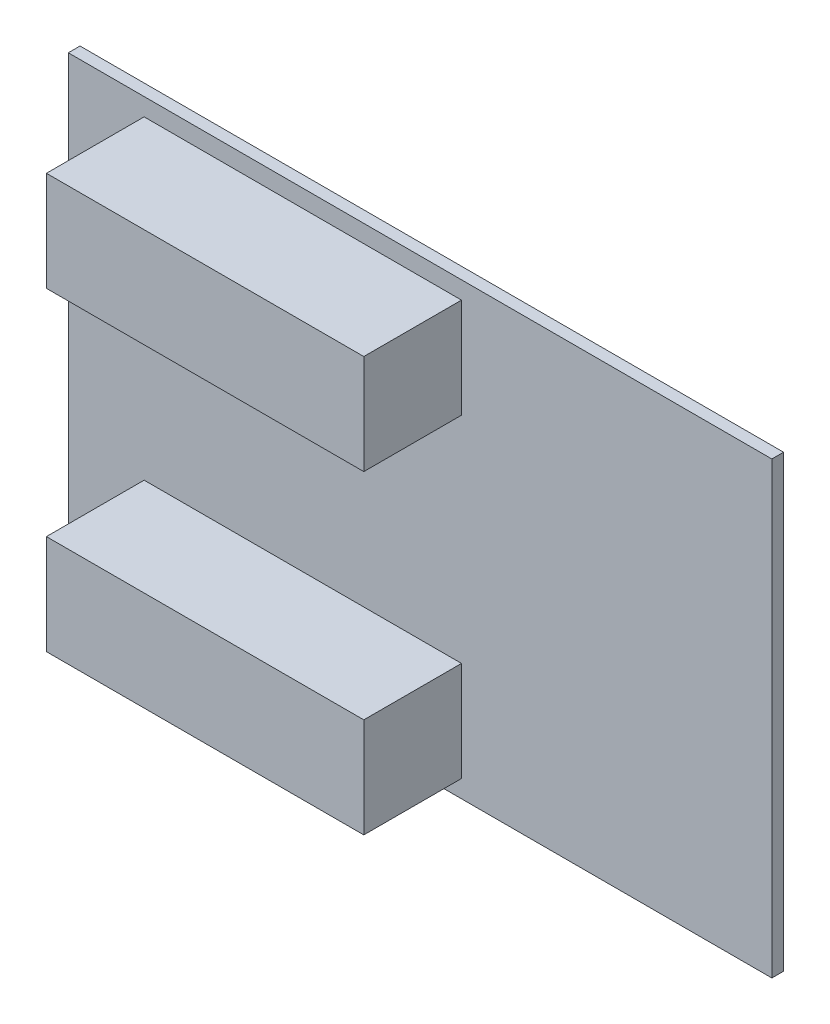
ISO-10303-21;
HEADER;
FILE_DESCRIPTION(('STEP AP214'),'2;1');
FILE_NAME('part.step','',(''),(''),'','','');
FILE_SCHEMA(('AUTOMOTIVE_DESIGN { 1 0 10303 214 1 1 1 1 }'));
ENDSEC;
DATA;
#1=APPLICATION_CONTEXT('core data for automotive mechanical design processes');
#2=APPLICATION_PROTOCOL_DEFINITION('international standard','automotive_design',2000,#1);
#3=PRODUCT_CONTEXT('',#1,'mechanical');
#4=PRODUCT('Part','Part','',(#3));
#5=PRODUCT_RELATED_PRODUCT_CATEGORY('part','',(#4));
#6=PRODUCT_DEFINITION_FORMATION('','',#4);
#7=PRODUCT_DEFINITION_CONTEXT('part definition',#1,'design');
#8=PRODUCT_DEFINITION('design','',#6,#7);
#9=PRODUCT_DEFINITION_SHAPE('','',#8);
#10=(LENGTH_UNIT() NAMED_UNIT(*) SI_UNIT(.MILLI.,.METRE.));
#11=(NAMED_UNIT(*) PLANE_ANGLE_UNIT() SI_UNIT($,.RADIAN.));
#12=(NAMED_UNIT(*) SI_UNIT($,.STERADIAN.) SOLID_ANGLE_UNIT());
#13=UNCERTAINTY_MEASURE_WITH_UNIT(LENGTH_MEASURE(1.E-05),#10,'distance_accuracy_value','');
#14=(GEOMETRIC_REPRESENTATION_CONTEXT(3) GLOBAL_UNCERTAINTY_ASSIGNED_CONTEXT((#13)) GLOBAL_UNIT_ASSIGNED_CONTEXT((#10,
#11,#12)) REPRESENTATION_CONTEXT('',''));
#15=CARTESIAN_POINT('',(0.,0.,0.));
#16=DIRECTION('',(0.,0.,1.));
#17=DIRECTION('',(1.,0.,0.));
#18=AXIS2_PLACEMENT_3D('',#15,#16,#17);
#19=CARTESIAN_POINT('',(0.,0.,3.));
#20=DIRECTION('',(0.,0.,1.));
#21=DIRECTION('',(1.,0.,0.));
#22=AXIS2_PLACEMENT_3D('',#19,#20,#21);
#23=PLANE('',#22);
#24=DIRECTION('',(-1.,0.,0.));
#25=VECTOR('',#24,1.);
#26=CARTESIAN_POINT('',(0.,44.2499999999999,3.));
#27=LINE('',#26,#25);
#28=CARTESIAN_POINT('',(-70.6,44.25,3.));
#29=VERTEX_POINT('',#28);
#30=CARTESIAN_POINT('',(-72.1,44.25,3.));
#31=VERTEX_POINT('',#30);
#32=EDGE_CURVE('E363',#29,#31,#27,.T.);
#33=ORIENTED_EDGE('',*,*,#32,.F.);
#34=DIRECTION('',(0.,-1.,0.));
#35=VECTOR('',#34,1.);
#36=CARTESIAN_POINT('',(-70.6,53.,3.));
#37=LINE('',#36,#35);
#38=CARTESIAN_POINT('',(-70.6,53.,3.));
#39=VERTEX_POINT('',#38);
#40=EDGE_CURVE('E400',#39,#29,#37,.T.);
#41=ORIENTED_EDGE('',*,*,#40,.F.);
#42=DIRECTION('',(-1.,0.,0.));
#43=VECTOR('',#42,1.);
#44=CARTESIAN_POINT('',(-70.6,53.,3.));
#45=LINE('',#44,#43);
#46=CARTESIAN_POINT('',(10.6,53.,3.));
#47=VERTEX_POINT('',#46);
#48=EDGE_CURVE('E393',#47,#39,#45,.T.);
#49=ORIENTED_EDGE('',*,*,#48,.F.);
#50=DIRECTION('',(0.,1.,0.));
#51=VECTOR('',#50,1.);
#52=CARTESIAN_POINT('',(10.6,53.,3.));
#53=LINE('',#52,#51);
#54=CARTESIAN_POINT('',(10.6,27.5,3.));
#55=VERTEX_POINT('',#54);
#56=EDGE_CURVE('E407',#55,#47,#53,.T.);
#57=ORIENTED_EDGE('',*,*,#56,.F.);
#58=DIRECTION('',(1.,0.,0.));
#59=VECTOR('',#58,1.);
#60=CARTESIAN_POINT('',(-70.6,27.5,3.));
#61=LINE('',#60,#59);
#62=CARTESIAN_POINT('',(-70.6,27.5,3.));
#63=VERTEX_POINT('',#62);
#64=EDGE_CURVE('E403',#63,#55,#61,.T.);
#65=ORIENTED_EDGE('',*,*,#64,.F.);
#66=CARTESIAN_POINT('',(-70.6,36.25,3.));
#67=VERTEX_POINT('',#66);
#68=EDGE_CURVE('E388',#67,#63,#37,.T.);
#69=ORIENTED_EDGE('',*,*,#68,.F.);
#70=DIRECTION('',(1.,0.,0.));
#71=VECTOR('',#70,1.);
#72=CARTESIAN_POINT('',(0.,36.25,3.));
#73=LINE('',#72,#71);
#74=CARTESIAN_POINT('',(-72.1,36.25,3.));
#75=VERTEX_POINT('',#74);
#76=EDGE_CURVE('E358',#75,#67,#73,.T.);
#77=ORIENTED_EDGE('',*,*,#76,.F.);
#78=DIRECTION('',(0.,-1.,0.));
#79=VECTOR('',#78,1.);
#80=CARTESIAN_POINT('',(-72.1,0.,3.));
#81=LINE('',#80,#79);
#82=EDGE_CURVE('E336',#31,#75,#81,.T.);
#83=ORIENTED_EDGE('',*,*,#82,.F.);
#84=EDGE_LOOP('',(#33,#41,#49,#57,#65,#69,#77,#83));
#85=FACE_BOUND('',#84,.T.);
#86=DIRECTION('',(0.,1.,0.));
#87=VECTOR('',#86,1.);
#88=CARTESIAN_POINT('',(90.,57.5,3.));
#89=LINE('',#88,#87);
#90=CARTESIAN_POINT('',(90.,-57.5,3.));
#91=VERTEX_POINT('',#90);
#92=CARTESIAN_POINT('',(90.,57.5,3.));
#93=VERTEX_POINT('',#92);
#94=EDGE_CURVE('E441',#91,#93,#89,.T.);
#95=ORIENTED_EDGE('',*,*,#94,.T.);
#96=DIRECTION('',(-1.,0.,0.));
#97=VECTOR('',#96,1.);
#98=CARTESIAN_POINT('',(-90.,57.5,3.));
#99=LINE('',#98,#97);
#100=CARTESIAN_POINT('',(-90.,57.5,3.));
#101=VERTEX_POINT('',#100);
#102=EDGE_CURVE('E444',#93,#101,#99,.T.);
#103=ORIENTED_EDGE('',*,*,#102,.T.);
#104=DIRECTION('',(0.,-1.,0.));
#105=VECTOR('',#104,1.);
#106=CARTESIAN_POINT('',(-90.,57.5,3.));
#107=LINE('',#106,#105);
#108=CARTESIAN_POINT('',(-90.,-57.5,3.));
#109=VERTEX_POINT('',#108);
#110=EDGE_CURVE('E447',#101,#109,#107,.T.);
#111=ORIENTED_EDGE('',*,*,#110,.T.);
#112=DIRECTION('',(1.,0.,0.));
#113=VECTOR('',#112,1.);
#114=CARTESIAN_POINT('',(-90.,-57.5,3.));
#115=LINE('',#114,#113);
#116=EDGE_CURVE('E449',#109,#91,#115,.T.);
#117=ORIENTED_EDGE('',*,*,#116,.T.);
#118=EDGE_LOOP('',(#95,#103,#111,#117));
#119=FACE_BOUND('',#118,.T.);
#120=DIRECTION('',(0.,1.,0.));
#121=VECTOR('',#120,1.);
#122=CARTESIAN_POINT('',(-70.6,-53.,3.));
#123=LINE('',#122,#121);
#124=CARTESIAN_POINT('',(-70.6,-53.,3.));
#125=VERTEX_POINT('',#124);
#126=CARTESIAN_POINT('',(-70.6,-44.25,3.));
#127=VERTEX_POINT('',#126);
#128=EDGE_CURVE('E301',#125,#127,#123,.T.);
#129=ORIENTED_EDGE('',*,*,#128,.T.);
#130=DIRECTION('',(-1.,0.,0.));
#131=VECTOR('',#130,1.);
#132=CARTESIAN_POINT('',(0.,-44.2499999999999,3.));
#133=LINE('',#132,#131);
#134=CARTESIAN_POINT('',(-72.1,-44.25,3.));
#135=VERTEX_POINT('',#134);
#136=EDGE_CURVE('E266',#127,#135,#133,.T.);
#137=ORIENTED_EDGE('',*,*,#136,.T.);
#138=DIRECTION('',(0.,1.,0.));
#139=VECTOR('',#138,1.);
#140=CARTESIAN_POINT('',(-72.1,0.,3.));
#141=LINE('',#140,#139);
#142=CARTESIAN_POINT('',(-72.1,-36.25,3.));
#143=VERTEX_POINT('',#142);
#144=EDGE_CURVE('E268',#135,#143,#141,.T.);
#145=ORIENTED_EDGE('',*,*,#144,.T.);
#146=DIRECTION('',(1.,0.,0.));
#147=VECTOR('',#146,1.);
#148=CARTESIAN_POINT('',(0.,-36.25,3.));
#149=LINE('',#148,#147);
#150=CARTESIAN_POINT('',(-70.6,-36.25,3.));
#151=VERTEX_POINT('',#150);
#152=EDGE_CURVE('E255',#143,#151,#149,.T.);
#153=ORIENTED_EDGE('',*,*,#152,.T.);
#154=CARTESIAN_POINT('',(-70.6,-27.5,3.));
#155=VERTEX_POINT('',#154);
#156=EDGE_CURVE('E286',#151,#155,#123,.T.);
#157=ORIENTED_EDGE('',*,*,#156,.T.);
#158=DIRECTION('',(1.,0.,0.));
#159=VECTOR('',#158,1.);
#160=CARTESIAN_POINT('',(-70.6,-27.5,3.));
#161=LINE('',#160,#159);
#162=CARTESIAN_POINT('',(10.6,-27.5,3.));
#163=VERTEX_POINT('',#162);
#164=EDGE_CURVE('E291',#155,#163,#161,.T.);
#165=ORIENTED_EDGE('',*,*,#164,.T.);
#166=DIRECTION('',(0.,-1.,0.));
#167=VECTOR('',#166,1.);
#168=CARTESIAN_POINT('',(10.6,-53.,3.));
#169=LINE('',#168,#167);
#170=CARTESIAN_POINT('',(10.6,-53.,3.));
#171=VERTEX_POINT('',#170);
#172=EDGE_CURVE('E308',#163,#171,#169,.T.);
#173=ORIENTED_EDGE('',*,*,#172,.T.);
#174=DIRECTION('',(-1.,0.,0.));
#175=VECTOR('',#174,1.);
#176=CARTESIAN_POINT('',(-70.6,-53.,3.));
#177=LINE('',#176,#175);
#178=EDGE_CURVE('E304',#171,#125,#177,.T.);
#179=ORIENTED_EDGE('',*,*,#178,.T.);
#180=EDGE_LOOP('',(#129,#137,#145,#153,#157,#165,#173,#179));
#181=FACE_BOUND('',#180,.T.);
#182=ADVANCED_FACE('F37',(#85,#119,#181),#23,.T.);
#183=CARTESIAN_POINT('',(8.1,-50.5,28.001));
#184=DIRECTION('',(-1.,0.,0.));
#185=DIRECTION('',(0.,-1.,0.));
#186=AXIS2_PLACEMENT_3D('',#183,#184,#185);
#187=PLANE('',#186);
#188=DIRECTION('',(0.,0.,-1.));
#189=VECTOR('',#188,1.);
#190=CARTESIAN_POINT('',(8.1,-50.5,28.001));
#191=LINE('',#190,#189);
#192=CARTESIAN_POINT('',(8.1,-50.5,25.5));
#193=VERTEX_POINT('',#192);
#194=CARTESIAN_POINT('',(8.1,-50.5,0.));
#195=VERTEX_POINT('',#194);
#196=EDGE_CURVE('E333',#193,#195,#191,.T.);
#197=ORIENTED_EDGE('',*,*,#196,.F.);
#198=DIRECTION('',(0.,1.,0.));
#199=VECTOR('',#198,1.);
#200=CARTESIAN_POINT('',(8.1,-50.5,25.5));
#201=LINE('',#200,#199);
#202=CARTESIAN_POINT('',(8.09999999999999,-30.,25.5));
#203=VERTEX_POINT('',#202);
#204=EDGE_CURVE('E283',#193,#203,#201,.T.);
#205=ORIENTED_EDGE('',*,*,#204,.T.);
#206=DIRECTION('',(0.,0.,-1.));
#207=VECTOR('',#206,1.);
#208=CARTESIAN_POINT('',(8.09999999999999,-30.,28.001));
#209=LINE('',#208,#207);
#210=CARTESIAN_POINT('',(8.09999999999999,-30.,0.));
#211=VERTEX_POINT('',#210);
#212=EDGE_CURVE('E334',#203,#211,#209,.T.);
#213=ORIENTED_EDGE('',*,*,#212,.T.);
#214=DIRECTION('',(0.,1.,0.));
#215=VECTOR('',#214,1.);
#216=CARTESIAN_POINT('',(8.1,-50.5,0.));
#217=LINE('',#216,#215);
#218=EDGE_CURVE('E321',#195,#211,#217,.T.);
#219=ORIENTED_EDGE('',*,*,#218,.F.);
#220=EDGE_LOOP('',(#197,#205,#213,#219));
#221=FACE_BOUND('',#220,.T.);
#222=ADVANCED_FACE('F494',(#221),#187,.T.);
#223=CARTESIAN_POINT('',(8.09999999999999,-30.,28.001));
#224=DIRECTION('',(0.,-1.,0.));
#225=DIRECTION('',(0.,0.,-1.));
#226=AXIS2_PLACEMENT_3D('',#223,#224,#225);
#227=PLANE('',#226);
#228=ORIENTED_EDGE('',*,*,#212,.F.);
#229=DIRECTION('',(-1.,0.,0.));
#230=VECTOR('',#229,1.);
#231=CARTESIAN_POINT('',(8.09999999999999,-30.,25.5));
#232=LINE('',#231,#230);
#233=CARTESIAN_POINT('',(-68.1,-30.,25.5));
#234=VERTEX_POINT('',#233);
#235=EDGE_CURVE('E280',#203,#234,#232,.T.);
#236=ORIENTED_EDGE('',*,*,#235,.T.);
#237=DIRECTION('',(0.,0.,-1.));
#238=VECTOR('',#237,1.);
#239=CARTESIAN_POINT('',(-68.1,-30.,28.001));
#240=LINE('',#239,#238);
#241=CARTESIAN_POINT('',(-68.1,-30.,0.));
#242=VERTEX_POINT('',#241);
#243=EDGE_CURVE('E337',#234,#242,#240,.T.);
#244=ORIENTED_EDGE('',*,*,#243,.T.);
#245=DIRECTION('',(-1.,0.,0.));
#246=VECTOR('',#245,1.);
#247=CARTESIAN_POINT('',(8.09999999999999,-30.,0.));
#248=LINE('',#247,#246);
#249=EDGE_CURVE('E330',#211,#242,#248,.T.);
#250=ORIENTED_EDGE('',*,*,#249,.F.);
#251=EDGE_LOOP('',(#228,#236,#244,#250));
#252=FACE_BOUND('',#251,.T.);
#253=ADVANCED_FACE('F500',(#252),#227,.T.);
#254=CARTESIAN_POINT('',(-68.1,-50.5,28.001));
#255=DIRECTION('',(1.,0.,0.));
#256=DIRECTION('',(0.,1.,0.));
#257=AXIS2_PLACEMENT_3D('',#254,#255,#256);
#258=PLANE('',#257);
#259=DIRECTION('',(0.,-1.,0.));
#260=VECTOR('',#259,1.);
#261=CARTESIAN_POINT('',(-68.1,0.,1.4));
#262=LINE('',#261,#260);
#263=CARTESIAN_POINT('',(-68.1,-36.25,1.4));
#264=VERTEX_POINT('',#263);
#265=CARTESIAN_POINT('',(-68.1,-44.25,1.4));
#266=VERTEX_POINT('',#265);
#267=EDGE_CURVE('E240',#264,#266,#262,.T.);
#268=ORIENTED_EDGE('',*,*,#267,.T.);
#269=DIRECTION('',(0.,0.,1.));
#270=VECTOR('',#269,1.);
#271=CARTESIAN_POINT('',(-68.1,-44.25,1.4));
#272=LINE('',#271,#270);
#273=CARTESIAN_POINT('',(-68.1,-44.25,3.));
#274=VERTEX_POINT('',#273);
#275=EDGE_CURVE('E246',#266,#274,#272,.T.);
#276=ORIENTED_EDGE('',*,*,#275,.T.);
#277=DIRECTION('',(0.,-1.,0.));
#278=VECTOR('',#277,1.);
#279=CARTESIAN_POINT('',(-68.1,0.,3.));
#280=LINE('',#279,#278);
#281=CARTESIAN_POINT('',(-68.1,-36.25,3.));
#282=VERTEX_POINT('',#281);
#283=EDGE_CURVE('E264',#282,#274,#280,.T.);
#284=ORIENTED_EDGE('',*,*,#283,.F.);
#285=DIRECTION('',(0.,0.,1.));
#286=VECTOR('',#285,1.);
#287=CARTESIAN_POINT('',(-68.1,-36.25,1.4));
#288=LINE('',#287,#286);
#289=EDGE_CURVE('E52',#264,#282,#288,.T.);
#290=ORIENTED_EDGE('',*,*,#289,.F.);
#291=EDGE_LOOP('',(#268,#276,#284,#290));
#292=FACE_BOUND('',#291,.T.);
#293=ORIENTED_EDGE('',*,*,#243,.F.);
#294=DIRECTION('',(0.,-1.,0.));
#295=VECTOR('',#294,1.);
#296=CARTESIAN_POINT('',(-68.1,-50.5,25.5));
#297=LINE('',#296,#295);
#298=CARTESIAN_POINT('',(-68.1,-50.5,25.5));
#299=VERTEX_POINT('',#298);
#300=EDGE_CURVE('E277',#234,#299,#297,.T.);
#301=ORIENTED_EDGE('',*,*,#300,.T.);
#302=DIRECTION('',(0.,0.,-1.));
#303=VECTOR('',#302,1.);
#304=CARTESIAN_POINT('',(-68.1,-50.5,28.001));
#305=LINE('',#304,#303);
#306=CARTESIAN_POINT('',(-68.1,-50.5,0.));
#307=VERTEX_POINT('',#306);
#308=EDGE_CURVE('E339',#299,#307,#305,.T.);
#309=ORIENTED_EDGE('',*,*,#308,.T.);
#310=DIRECTION('',(0.,-1.,0.));
#311=VECTOR('',#310,1.);
#312=CARTESIAN_POINT('',(-68.1,-50.5,0.));
#313=LINE('',#312,#311);
#314=EDGE_CURVE('E327',#242,#307,#313,.T.);
#315=ORIENTED_EDGE('',*,*,#314,.F.);
#316=EDGE_LOOP('',(#293,#301,#309,#315));
#317=FACE_BOUND('',#316,.T.);
#318=ADVANCED_FACE('F253',(#292,#317),#258,.T.);
#319=CARTESIAN_POINT('',(8.1,-50.5,28.001));
#320=DIRECTION('',(0.,1.,0.));
#321=DIRECTION('',(0.,0.,1.));
#322=AXIS2_PLACEMENT_3D('',#319,#320,#321);
#323=PLANE('',#322);
#324=ORIENTED_EDGE('',*,*,#308,.F.);
#325=DIRECTION('',(1.,0.,0.));
#326=VECTOR('',#325,1.);
#327=CARTESIAN_POINT('',(8.1,-50.5,25.5));
#328=LINE('',#327,#326);
#329=EDGE_CURVE('E250',#299,#193,#328,.T.);
#330=ORIENTED_EDGE('',*,*,#329,.T.);
#331=ORIENTED_EDGE('',*,*,#196,.T.);
#332=DIRECTION('',(1.,0.,0.));
#333=VECTOR('',#332,1.);
#334=CARTESIAN_POINT('',(8.1,-50.5,0.));
#335=LINE('',#334,#333);
#336=EDGE_CURVE('E324',#307,#195,#335,.T.);
#337=ORIENTED_EDGE('',*,*,#336,.F.);
#338=EDGE_LOOP('',(#324,#330,#331,#337));
#339=FACE_BOUND('',#338,.T.);
#340=ADVANCED_FACE('F511',(#339),#323,.T.);
#341=CARTESIAN_POINT('',(0.,0.,0.));
#342=DIRECTION('',(0.,0.,1.));
#343=DIRECTION('',(1.,0.,0.));
#344=AXIS2_PLACEMENT_3D('',#341,#342,#343);
#345=PLANE('',#344);
#346=DIRECTION('',(0.,1.,0.));
#347=VECTOR('',#346,1.);
#348=CARTESIAN_POINT('',(90.,57.5,0.));
#349=LINE('',#348,#347);
#350=CARTESIAN_POINT('',(90.,-57.5,0.));
#351=VERTEX_POINT('',#350);
#352=CARTESIAN_POINT('',(90.,57.5,0.));
#353=VERTEX_POINT('',#352);
#354=EDGE_CURVE('E435',#351,#353,#349,.T.);
#355=ORIENTED_EDGE('',*,*,#354,.F.);
#356=DIRECTION('',(1.,0.,0.));
#357=VECTOR('',#356,1.);
#358=CARTESIAN_POINT('',(-90.,-57.5,0.));
#359=LINE('',#358,#357);
#360=CARTESIAN_POINT('',(-90.,-57.5,0.));
#361=VERTEX_POINT('',#360);
#362=EDGE_CURVE('E445',#361,#351,#359,.T.);
#363=ORIENTED_EDGE('',*,*,#362,.F.);
#364=DIRECTION('',(0.,-1.,0.));
#365=VECTOR('',#364,1.);
#366=CARTESIAN_POINT('',(-90.,57.5,0.));
#367=LINE('',#366,#365);
#368=CARTESIAN_POINT('',(-90.,57.5,0.));
#369=VERTEX_POINT('',#368);
#370=EDGE_CURVE('E456',#369,#361,#367,.T.);
#371=ORIENTED_EDGE('',*,*,#370,.F.);
#372=DIRECTION('',(-1.,0.,0.));
#373=VECTOR('',#372,1.);
#374=CARTESIAN_POINT('',(-90.,57.5,0.));
#375=LINE('',#374,#373);
#376=EDGE_CURVE('E454',#353,#369,#375,.T.);
#377=ORIENTED_EDGE('',*,*,#376,.F.);
#378=EDGE_LOOP('',(#355,#363,#371,#377));
#379=FACE_BOUND('',#378,.T.);
#380=DIRECTION('',(-1.,0.,0.));
#381=VECTOR('',#380,1.);
#382=CARTESIAN_POINT('',(8.09999999999999,30.,0.));
#383=LINE('',#382,#381);
#384=CARTESIAN_POINT('',(8.09999999999999,30.,0.));
#385=VERTEX_POINT('',#384);
#386=CARTESIAN_POINT('',(-68.1,30.,0.));
#387=VERTEX_POINT('',#386);
#388=EDGE_CURVE('E423',#385,#387,#383,.T.);
#389=ORIENTED_EDGE('',*,*,#388,.F.);
#390=DIRECTION('',(0.,-1.,0.));
#391=VECTOR('',#390,1.);
#392=CARTESIAN_POINT('',(8.1,50.5,0.));
#393=LINE('',#392,#391);
#394=CARTESIAN_POINT('',(8.1,50.5,0.));
#395=VERTEX_POINT('',#394);
#396=EDGE_CURVE('E420',#395,#385,#393,.T.);
#397=ORIENTED_EDGE('',*,*,#396,.F.);
#398=DIRECTION('',(1.,0.,0.));
#399=VECTOR('',#398,1.);
#400=CARTESIAN_POINT('',(8.1,50.5,0.));
#401=LINE('',#400,#399);
#402=CARTESIAN_POINT('',(-68.1,50.5,0.));
#403=VERTEX_POINT('',#402);
#404=EDGE_CURVE('E429',#403,#395,#401,.T.);
#405=ORIENTED_EDGE('',*,*,#404,.F.);
#406=DIRECTION('',(0.,1.,0.));
#407=VECTOR('',#406,1.);
#408=CARTESIAN_POINT('',(-68.1,50.5,0.));
#409=LINE('',#408,#407);
#410=EDGE_CURVE('E426',#387,#403,#409,.T.);
#411=ORIENTED_EDGE('',*,*,#410,.F.);
#412=EDGE_LOOP('',(#389,#397,#405,#411));
#413=FACE_BOUND('',#412,.T.);
#414=ORIENTED_EDGE('',*,*,#218,.T.);
#415=ORIENTED_EDGE('',*,*,#249,.T.);
#416=ORIENTED_EDGE('',*,*,#314,.T.);
#417=ORIENTED_EDGE('',*,*,#336,.T.);
#418=EDGE_LOOP('',(#414,#415,#416,#417));
#419=FACE_BOUND('',#418,.T.);
#420=ADVANCED_FACE('F474',(#379,#413,#419),#345,.F.);
#421=CARTESIAN_POINT('',(-68.1,50.5,3.001));
#422=DIRECTION('',(-1.,0.,0.));
#423=DIRECTION('',(0.,-1.,0.));
#424=AXIS2_PLACEMENT_3D('',#421,#422,#423);
#425=PLANE('',#424);
#426=DIRECTION('',(0.,1.,0.));
#427=VECTOR('',#426,1.);
#428=CARTESIAN_POINT('',(-68.1,50.5,25.5));
#429=LINE('',#428,#427);
#430=CARTESIAN_POINT('',(-68.1,30.,25.5));
#431=VERTEX_POINT('',#430);
#432=CARTESIAN_POINT('',(-68.1,50.5,25.5));
#433=VERTEX_POINT('',#432);
#434=EDGE_CURVE('E379',#431,#433,#429,.T.);
#435=ORIENTED_EDGE('',*,*,#434,.F.);
#436=DIRECTION('',(0.,0.,-1.));
#437=VECTOR('',#436,1.);
#438=CARTESIAN_POINT('',(-68.1,30.,3.001));
#439=LINE('',#438,#437);
#440=EDGE_CURVE('E438',#431,#387,#439,.T.);
#441=ORIENTED_EDGE('',*,*,#440,.T.);
#442=ORIENTED_EDGE('',*,*,#410,.T.);
#443=DIRECTION('',(0.,0.,-1.));
#444=VECTOR('',#443,1.);
#445=CARTESIAN_POINT('',(-68.1,50.5,3.001));
#446=LINE('',#445,#444);
#447=EDGE_CURVE('E436',#433,#403,#446,.T.);
#448=ORIENTED_EDGE('',*,*,#447,.F.);
#449=EDGE_LOOP('',(#435,#441,#442,#448));
#450=FACE_BOUND('',#449,.T.);
#451=DIRECTION('',(0.,1.,0.));
#452=VECTOR('',#451,1.);
#453=CARTESIAN_POINT('',(-68.1,0.,1.4));
#454=LINE('',#453,#452);
#455=CARTESIAN_POINT('',(-68.1,36.25,1.4));
#456=VERTEX_POINT('',#455);
#457=CARTESIAN_POINT('',(-68.1,44.25,1.4));
#458=VERTEX_POINT('',#457);
#459=EDGE_CURVE('E349',#456,#458,#454,.T.);
#460=ORIENTED_EDGE('',*,*,#459,.F.);
#461=DIRECTION('',(0.,0.,1.));
#462=VECTOR('',#461,1.);
#463=CARTESIAN_POINT('',(-68.1,36.25,1.4));
#464=LINE('',#463,#462);
#465=CARTESIAN_POINT('',(-68.1,36.25,3.));
#466=VERTEX_POINT('',#465);
#467=EDGE_CURVE('E373',#456,#466,#464,.T.);
#468=ORIENTED_EDGE('',*,*,#467,.T.);
#469=DIRECTION('',(0.,1.,0.));
#470=VECTOR('',#469,1.);
#471=CARTESIAN_POINT('',(-68.1,0.,3.));
#472=LINE('',#471,#470);
#473=CARTESIAN_POINT('',(-68.1,44.25,3.));
#474=VERTEX_POINT('',#473);
#475=EDGE_CURVE('E360',#466,#474,#472,.T.);
#476=ORIENTED_EDGE('',*,*,#475,.T.);
#477=DIRECTION('',(0.,0.,1.));
#478=VECTOR('',#477,1.);
#479=CARTESIAN_POINT('',(-68.1,44.25,1.4));
#480=LINE('',#479,#478);
#481=EDGE_CURVE('E370',#458,#474,#480,.T.);
#482=ORIENTED_EDGE('',*,*,#481,.F.);
#483=EDGE_LOOP('',(#460,#468,#476,#482));
#484=FACE_BOUND('',#483,.T.);
#485=ADVANCED_FACE('F510',(#450,#484),#425,.F.);
#486=CARTESIAN_POINT('',(8.1,50.5,3.001));
#487=DIRECTION('',(1.,0.,0.));
#488=DIRECTION('',(0.,1.,0.));
#489=AXIS2_PLACEMENT_3D('',#486,#487,#488);
#490=PLANE('',#489);
#491=DIRECTION('',(0.,-1.,0.));
#492=VECTOR('',#491,1.);
#493=CARTESIAN_POINT('',(8.1,50.5,25.5));
#494=LINE('',#493,#492);
#495=CARTESIAN_POINT('',(8.1,50.5,25.5));
#496=VERTEX_POINT('',#495);
#497=CARTESIAN_POINT('',(8.09999999999999,30.,25.5));
#498=VERTEX_POINT('',#497);
#499=EDGE_CURVE('E385',#496,#498,#494,.T.);
#500=ORIENTED_EDGE('',*,*,#499,.F.);
#501=DIRECTION('',(0.,0.,-1.));
#502=VECTOR('',#501,1.);
#503=CARTESIAN_POINT('',(8.1,50.5,3.001));
#504=LINE('',#503,#502);
#505=EDGE_CURVE('E433',#496,#395,#504,.T.);
#506=ORIENTED_EDGE('',*,*,#505,.T.);
#507=ORIENTED_EDGE('',*,*,#396,.T.);
#508=DIRECTION('',(0.,0.,-1.));
#509=VECTOR('',#508,1.);
#510=CARTESIAN_POINT('',(8.09999999999999,30.,3.001));
#511=LINE('',#510,#509);
#512=EDGE_CURVE('E432',#498,#385,#511,.T.);
#513=ORIENTED_EDGE('',*,*,#512,.F.);
#514=EDGE_LOOP('',(#500,#506,#507,#513));
#515=FACE_BOUND('',#514,.T.);
#516=ADVANCED_FACE('F506',(#515),#490,.F.);
#517=CARTESIAN_POINT('',(8.1,50.5,3.001));
#518=DIRECTION('',(0.,1.,0.));
#519=DIRECTION('',(0.,0.,1.));
#520=AXIS2_PLACEMENT_3D('',#517,#518,#519);
#521=PLANE('',#520);
#522=DIRECTION('',(1.,0.,0.));
#523=VECTOR('',#522,1.);
#524=CARTESIAN_POINT('',(8.1,50.5,25.5));
#525=LINE('',#524,#523);
#526=EDGE_CURVE('E382',#433,#496,#525,.T.);
#527=ORIENTED_EDGE('',*,*,#526,.F.);
#528=ORIENTED_EDGE('',*,*,#447,.T.);
#529=ORIENTED_EDGE('',*,*,#404,.T.);
#530=ORIENTED_EDGE('',*,*,#505,.F.);
#531=EDGE_LOOP('',(#527,#528,#529,#530));
#532=FACE_BOUND('',#531,.T.);
#533=ADVANCED_FACE('F541',(#532),#521,.F.);
#534=CARTESIAN_POINT('',(8.09999999999999,30.,3.001));
#535=DIRECTION('',(0.,-1.,0.));
#536=DIRECTION('',(0.,0.,-1.));
#537=AXIS2_PLACEMENT_3D('',#534,#535,#536);
#538=PLANE('',#537);
#539=DIRECTION('',(-1.,0.,0.));
#540=VECTOR('',#539,1.);
#541=CARTESIAN_POINT('',(8.09999999999999,30.,25.5));
#542=LINE('',#541,#540);
#543=EDGE_CURVE('E369',#498,#431,#542,.T.);
#544=ORIENTED_EDGE('',*,*,#543,.F.);
#545=ORIENTED_EDGE('',*,*,#512,.T.);
#546=ORIENTED_EDGE('',*,*,#388,.T.);
#547=ORIENTED_EDGE('',*,*,#440,.F.);
#548=EDGE_LOOP('',(#544,#545,#546,#547));
#549=FACE_BOUND('',#548,.T.);
#550=ADVANCED_FACE('F492',(#549),#538,.F.);
#551=CARTESIAN_POINT('',(90.,57.5,3.));
#552=DIRECTION('',(-1.,0.,0.));
#553=DIRECTION('',(0.,0.,1.));
#554=AXIS2_PLACEMENT_3D('',#551,#552,#553);
#555=PLANE('',#554);
#556=ORIENTED_EDGE('',*,*,#354,.T.);
#557=DIRECTION('',(0.,0.,-1.));
#558=VECTOR('',#557,1.);
#559=CARTESIAN_POINT('',(90.,57.5,3.));
#560=LINE('',#559,#558);
#561=EDGE_CURVE('E11',#93,#353,#560,.T.);
#562=ORIENTED_EDGE('',*,*,#561,.F.);
#563=ORIENTED_EDGE('',*,*,#94,.F.);
#564=DIRECTION('',(0.,0.,-1.));
#565=VECTOR('',#564,1.);
#566=CARTESIAN_POINT('',(90.,-57.5,3.));
#567=LINE('',#566,#565);
#568=EDGE_CURVE('E451',#91,#351,#567,.T.);
#569=ORIENTED_EDGE('',*,*,#568,.T.);
#570=EDGE_LOOP('',(#556,#562,#563,#569));
#571=FACE_BOUND('',#570,.T.);
#572=ADVANCED_FACE('F39',(#571),#555,.F.);
#573=CARTESIAN_POINT('',(-90.,57.5,3.));
#574=DIRECTION('',(0.,-1.,0.));
#575=DIRECTION('',(0.,0.,-1.));
#576=AXIS2_PLACEMENT_3D('',#573,#574,#575);
#577=PLANE('',#576);
#578=ORIENTED_EDGE('',*,*,#376,.T.);
#579=DIRECTION('',(0.,0.,-1.));
#580=VECTOR('',#579,1.);
#581=CARTESIAN_POINT('',(-90.,57.5,3.));
#582=LINE('',#581,#580);
#583=EDGE_CURVE('E45',#101,#369,#582,.T.);
#584=ORIENTED_EDGE('',*,*,#583,.F.);
#585=ORIENTED_EDGE('',*,*,#102,.F.);
#586=ORIENTED_EDGE('',*,*,#561,.T.);
#587=EDGE_LOOP('',(#578,#584,#585,#586));
#588=FACE_BOUND('',#587,.T.);
#589=ADVANCED_FACE('F485',(#588),#577,.F.);
#590=CARTESIAN_POINT('',(-90.,57.5,3.));
#591=DIRECTION('',(1.,0.,0.));
#592=DIRECTION('',(0.,0.,-1.));
#593=AXIS2_PLACEMENT_3D('',#590,#591,#592);
#594=PLANE('',#593);
#595=ORIENTED_EDGE('',*,*,#370,.T.);
#596=DIRECTION('',(0.,0.,-1.));
#597=VECTOR('',#596,1.);
#598=CARTESIAN_POINT('',(-90.,-57.5,3.));
#599=LINE('',#598,#597);
#600=EDGE_CURVE('E461',#109,#361,#599,.T.);
#601=ORIENTED_EDGE('',*,*,#600,.F.);
#602=ORIENTED_EDGE('',*,*,#110,.F.);
#603=ORIENTED_EDGE('',*,*,#583,.T.);
#604=EDGE_LOOP('',(#595,#601,#602,#603));
#605=FACE_BOUND('',#604,.T.);
#606=ADVANCED_FACE('F468',(#605),#594,.F.);
#607=CARTESIAN_POINT('',(-90.,-57.5,3.));
#608=DIRECTION('',(0.,1.,0.));
#609=DIRECTION('',(0.,0.,1.));
#610=AXIS2_PLACEMENT_3D('',#607,#608,#609);
#611=PLANE('',#610);
#612=ORIENTED_EDGE('',*,*,#362,.T.);
#613=ORIENTED_EDGE('',*,*,#568,.F.);
#614=ORIENTED_EDGE('',*,*,#116,.F.);
#615=ORIENTED_EDGE('',*,*,#600,.T.);
#616=EDGE_LOOP('',(#612,#613,#614,#615));
#617=FACE_BOUND('',#616,.T.);
#618=ADVANCED_FACE('F478',(#617),#611,.F.);
#619=CARTESIAN_POINT('',(0.,0.,28.));
#620=DIRECTION('',(0.,0.,1.));
#621=DIRECTION('',(1.,0.,0.));
#622=AXIS2_PLACEMENT_3D('',#619,#620,#621);
#623=PLANE('',#622);
#624=DIRECTION('',(0.,-1.,0.));
#625=VECTOR('',#624,1.);
#626=CARTESIAN_POINT('',(-70.6,53.,28.));
#627=LINE('',#626,#625);
#628=CARTESIAN_POINT('',(-70.6,53.,28.));
#629=VERTEX_POINT('',#628);
#630=CARTESIAN_POINT('',(-70.6,27.5,28.));
#631=VERTEX_POINT('',#630);
#632=EDGE_CURVE('E389',#629,#631,#627,.T.);
#633=ORIENTED_EDGE('',*,*,#632,.T.);
#634=DIRECTION('',(1.,0.,0.));
#635=VECTOR('',#634,1.);
#636=CARTESIAN_POINT('',(-70.6,27.5,28.));
#637=LINE('',#636,#635);
#638=CARTESIAN_POINT('',(10.6,27.5,28.));
#639=VERTEX_POINT('',#638);
#640=EDGE_CURVE('E392',#631,#639,#637,.T.);
#641=ORIENTED_EDGE('',*,*,#640,.T.);
#642=DIRECTION('',(0.,1.,0.));
#643=VECTOR('',#642,1.);
#644=CARTESIAN_POINT('',(10.6,53.,28.));
#645=LINE('',#644,#643);
#646=CARTESIAN_POINT('',(10.6,53.,28.));
#647=VERTEX_POINT('',#646);
#648=EDGE_CURVE('E395',#639,#647,#645,.T.);
#649=ORIENTED_EDGE('',*,*,#648,.T.);
#650=DIRECTION('',(-1.,0.,0.));
#651=VECTOR('',#650,1.);
#652=CARTESIAN_POINT('',(-70.6,53.,28.));
#653=LINE('',#652,#651);
#654=EDGE_CURVE('E397',#647,#629,#653,.T.);
#655=ORIENTED_EDGE('',*,*,#654,.T.);
#656=EDGE_LOOP('',(#633,#641,#649,#655));
#657=FACE_BOUND('',#656,.T.);
#658=ADVANCED_FACE('F513',(#657),#623,.T.);
#659=CARTESIAN_POINT('',(-70.6,53.,28.));
#660=DIRECTION('',(1.,0.,0.));
#661=DIRECTION('',(0.,0.,-1.));
#662=AXIS2_PLACEMENT_3D('',#659,#660,#661);
#663=PLANE('',#662);
#664=DIRECTION('',(0.,0.,-1.));
#665=VECTOR('',#664,1.);
#666=CARTESIAN_POINT('',(-70.6,53.,28.));
#667=LINE('',#666,#665);
#668=EDGE_CURVE('E399',#629,#39,#667,.T.);
#669=ORIENTED_EDGE('',*,*,#668,.T.);
#670=ORIENTED_EDGE('',*,*,#40,.T.);
#671=EDGE_CURVE('E404',#29,#67,#37,.T.);
#672=ORIENTED_EDGE('',*,*,#671,.T.);
#673=ORIENTED_EDGE('',*,*,#68,.T.);
#674=DIRECTION('',(0.,0.,-1.));
#675=VECTOR('',#674,1.);
#676=CARTESIAN_POINT('',(-70.6,27.5,28.));
#677=LINE('',#676,#675);
#678=EDGE_CURVE('E417',#631,#63,#677,.T.);
#679=ORIENTED_EDGE('',*,*,#678,.F.);
#680=ORIENTED_EDGE('',*,*,#632,.F.);
#681=EDGE_LOOP('',(#669,#670,#672,#673,#679,#680));
#682=FACE_BOUND('',#681,.T.);
#683=ADVANCED_FACE('F517',(#682),#663,.F.);
#684=CARTESIAN_POINT('',(-70.6,27.5,28.));
#685=DIRECTION('',(0.,1.,0.));
#686=DIRECTION('',(0.,0.,1.));
#687=AXIS2_PLACEMENT_3D('',#684,#685,#686);
#688=PLANE('',#687);
#689=ORIENTED_EDGE('',*,*,#678,.T.);
#690=ORIENTED_EDGE('',*,*,#64,.T.);
#691=DIRECTION('',(0.,0.,-1.));
#692=VECTOR('',#691,1.);
#693=CARTESIAN_POINT('',(10.6,27.5,28.));
#694=LINE('',#693,#692);
#695=EDGE_CURVE('E415',#639,#55,#694,.T.);
#696=ORIENTED_EDGE('',*,*,#695,.F.);
#697=ORIENTED_EDGE('',*,*,#640,.F.);
#698=EDGE_LOOP('',(#689,#690,#696,#697));
#699=FACE_BOUND('',#698,.T.);
#700=ADVANCED_FACE('F523',(#699),#688,.F.);
#701=CARTESIAN_POINT('',(10.6,53.,28.));
#702=DIRECTION('',(-1.,0.,0.));
#703=DIRECTION('',(0.,0.,1.));
#704=AXIS2_PLACEMENT_3D('',#701,#702,#703);
#705=PLANE('',#704);
#706=ORIENTED_EDGE('',*,*,#695,.T.);
#707=ORIENTED_EDGE('',*,*,#56,.T.);
#708=DIRECTION('',(0.,0.,-1.));
#709=VECTOR('',#708,1.);
#710=CARTESIAN_POINT('',(10.6,53.,28.));
#711=LINE('',#710,#709);
#712=EDGE_CURVE('E413',#647,#47,#711,.T.);
#713=ORIENTED_EDGE('',*,*,#712,.F.);
#714=ORIENTED_EDGE('',*,*,#648,.F.);
#715=EDGE_LOOP('',(#706,#707,#713,#714));
#716=FACE_BOUND('',#715,.T.);
#717=ADVANCED_FACE('F533',(#716),#705,.F.);
#718=CARTESIAN_POINT('',(-70.6,53.,28.));
#719=DIRECTION('',(0.,-1.,0.));
#720=DIRECTION('',(0.,0.,-1.));
#721=AXIS2_PLACEMENT_3D('',#718,#719,#720);
#722=PLANE('',#721);
#723=ORIENTED_EDGE('',*,*,#712,.T.);
#724=ORIENTED_EDGE('',*,*,#48,.T.);
#725=ORIENTED_EDGE('',*,*,#668,.F.);
#726=ORIENTED_EDGE('',*,*,#654,.F.);
#727=EDGE_LOOP('',(#723,#724,#725,#726));
#728=FACE_BOUND('',#727,.T.);
#729=ADVANCED_FACE('F530',(#728),#722,.F.);
#730=CARTESIAN_POINT('',(0.,0.,25.5));
#731=DIRECTION('',(0.,0.,1.));
#732=DIRECTION('',(1.,0.,0.));
#733=AXIS2_PLACEMENT_3D('',#730,#731,#732);
#734=PLANE('',#733);
#735=ORIENTED_EDGE('',*,*,#526,.T.);
#736=ORIENTED_EDGE('',*,*,#499,.T.);
#737=ORIENTED_EDGE('',*,*,#543,.T.);
#738=ORIENTED_EDGE('',*,*,#434,.T.);
#739=EDGE_LOOP('',(#735,#736,#737,#738));
#740=FACE_BOUND('',#739,.T.);
#741=ADVANCED_FACE('F528',(#740),#734,.F.);
#742=CARTESIAN_POINT('',(0.,0.,3.));
#743=DIRECTION('',(0.,0.,1.));
#744=DIRECTION('',(1.,0.,0.));
#745=AXIS2_PLACEMENT_3D('',#742,#743,#744);
#746=PLANE('',#745);
#747=EDGE_CURVE('E346',#474,#29,#27,.T.);
#748=ORIENTED_EDGE('',*,*,#747,.F.);
#749=ORIENTED_EDGE('',*,*,#475,.F.);
#750=EDGE_CURVE('E357',#67,#466,#73,.T.);
#751=ORIENTED_EDGE('',*,*,#750,.F.);
#752=ORIENTED_EDGE('',*,*,#671,.F.);
#753=EDGE_LOOP('',(#748,#749,#751,#752));
#754=FACE_BOUND('',#753,.T.);
#755=ADVANCED_FACE('F615',(#754),#746,.F.);
#756=CARTESIAN_POINT('',(-72.1,0.,1.4));
#757=DIRECTION('',(-1.,0.,0.));
#758=DIRECTION('',(0.,0.,1.));
#759=AXIS2_PLACEMENT_3D('',#756,#757,#758);
#760=PLANE('',#759);
#761=ORIENTED_EDGE('',*,*,#82,.T.);
#762=DIRECTION('',(0.,0.,1.));
#763=VECTOR('',#762,1.);
#764=CARTESIAN_POINT('',(-72.1,36.25,1.4));
#765=LINE('',#764,#763);
#766=CARTESIAN_POINT('',(-72.1,36.25,1.4));
#767=VERTEX_POINT('',#766);
#768=EDGE_CURVE('E354',#767,#75,#765,.T.);
#769=ORIENTED_EDGE('',*,*,#768,.F.);
#770=DIRECTION('',(0.,-1.,0.));
#771=VECTOR('',#770,1.);
#772=CARTESIAN_POINT('',(-72.1,0.,1.4));
#773=LINE('',#772,#771);
#774=CARTESIAN_POINT('',(-72.1,44.25,1.4));
#775=VERTEX_POINT('',#774);
#776=EDGE_CURVE('E342',#775,#767,#773,.T.);
#777=ORIENTED_EDGE('',*,*,#776,.F.);
#778=DIRECTION('',(0.,0.,1.));
#779=VECTOR('',#778,1.);
#780=CARTESIAN_POINT('',(-72.1,44.25,1.4));
#781=LINE('',#780,#779);
#782=EDGE_CURVE('E366',#775,#31,#781,.T.);
#783=ORIENTED_EDGE('',*,*,#782,.T.);
#784=EDGE_LOOP('',(#761,#769,#777,#783));
#785=FACE_BOUND('',#784,.T.);
#786=ADVANCED_FACE('F618',(#785),#760,.F.);
#787=CARTESIAN_POINT('',(0.,44.2499999999999,1.4));
#788=DIRECTION('',(0.,1.,0.));
#789=DIRECTION('',(-1.,0.,0.));
#790=AXIS2_PLACEMENT_3D('',#787,#788,#789);
#791=PLANE('',#790);
#792=ORIENTED_EDGE('',*,*,#747,.T.);
#793=ORIENTED_EDGE('',*,*,#32,.T.);
#794=ORIENTED_EDGE('',*,*,#782,.F.);
#795=DIRECTION('',(-1.,0.,0.));
#796=VECTOR('',#795,1.);
#797=CARTESIAN_POINT('',(0.,44.2499999999999,1.4));
#798=LINE('',#797,#796);
#799=EDGE_CURVE('E351',#458,#775,#798,.T.);
#800=ORIENTED_EDGE('',*,*,#799,.F.);
#801=ORIENTED_EDGE('',*,*,#481,.T.);
#802=EDGE_LOOP('',(#792,#793,#794,#800,#801));
#803=FACE_BOUND('',#802,.T.);
#804=ADVANCED_FACE('F620',(#803),#791,.F.);
#805=CARTESIAN_POINT('',(0.,36.25,1.4));
#806=DIRECTION('',(0.,-1.,0.));
#807=DIRECTION('',(0.,0.,-1.));
#808=AXIS2_PLACEMENT_3D('',#805,#806,#807);
#809=PLANE('',#808);
#810=ORIENTED_EDGE('',*,*,#76,.T.);
#811=ORIENTED_EDGE('',*,*,#750,.T.);
#812=ORIENTED_EDGE('',*,*,#467,.F.);
#813=DIRECTION('',(1.,0.,0.));
#814=VECTOR('',#813,1.);
#815=CARTESIAN_POINT('',(0.,36.25,1.4));
#816=LINE('',#815,#814);
#817=EDGE_CURVE('E345',#767,#456,#816,.T.);
#818=ORIENTED_EDGE('',*,*,#817,.F.);
#819=ORIENTED_EDGE('',*,*,#768,.T.);
#820=EDGE_LOOP('',(#810,#811,#812,#818,#819));
#821=FACE_BOUND('',#820,.T.);
#822=ADVANCED_FACE('F613',(#821),#809,.F.);
#823=CARTESIAN_POINT('',(0.,0.,1.4));
#824=DIRECTION('',(0.,0.,1.));
#825=DIRECTION('',(1.,0.,0.));
#826=AXIS2_PLACEMENT_3D('',#823,#824,#825);
#827=PLANE('',#826);
#828=ORIENTED_EDGE('',*,*,#776,.T.);
#829=ORIENTED_EDGE('',*,*,#817,.T.);
#830=ORIENTED_EDGE('',*,*,#459,.T.);
#831=ORIENTED_EDGE('',*,*,#799,.T.);
#832=EDGE_LOOP('',(#828,#829,#830,#831));
#833=FACE_BOUND('',#832,.T.);
#834=ADVANCED_FACE('F603',(#833),#827,.T.);
#835=CARTESIAN_POINT('',(-70.6,-53.,28.));
#836=DIRECTION('',(-1.,0.,0.));
#837=DIRECTION('',(0.,0.,1.));
#838=AXIS2_PLACEMENT_3D('',#835,#836,#837);
#839=PLANE('',#838);
#840=DIRECTION('',(0.,0.,-1.));
#841=VECTOR('',#840,1.);
#842=CARTESIAN_POINT('',(-70.6,-27.5,28.));
#843=LINE('',#842,#841);
#844=CARTESIAN_POINT('',(-70.6,-27.5,28.));
#845=VERTEX_POINT('',#844);
#846=EDGE_CURVE('E300',#845,#155,#843,.T.);
#847=ORIENTED_EDGE('',*,*,#846,.T.);
#848=ORIENTED_EDGE('',*,*,#156,.F.);
#849=EDGE_CURVE('E305',#127,#151,#123,.T.);
#850=ORIENTED_EDGE('',*,*,#849,.F.);
#851=ORIENTED_EDGE('',*,*,#128,.F.);
#852=DIRECTION('',(0.,0.,-1.));
#853=VECTOR('',#852,1.);
#854=CARTESIAN_POINT('',(-70.6,-53.,28.));
#855=LINE('',#854,#853);
#856=CARTESIAN_POINT('',(-70.6,-53.,28.));
#857=VERTEX_POINT('',#856);
#858=EDGE_CURVE('E319',#857,#125,#855,.T.);
#859=ORIENTED_EDGE('',*,*,#858,.F.);
#860=DIRECTION('',(0.,1.,0.));
#861=VECTOR('',#860,1.);
#862=CARTESIAN_POINT('',(-70.6,-53.,28.));
#863=LINE('',#862,#861);
#864=EDGE_CURVE('E287',#857,#845,#863,.T.);
#865=ORIENTED_EDGE('',*,*,#864,.T.);
#866=EDGE_LOOP('',(#847,#848,#850,#851,#859,#865));
#867=FACE_BOUND('',#866,.T.);
#868=ADVANCED_FACE('F599',(#867),#839,.T.);
#869=CARTESIAN_POINT('',(-70.6,-53.,28.));
#870=DIRECTION('',(0.,-1.,0.));
#871=DIRECTION('',(0.,0.,-1.));
#872=AXIS2_PLACEMENT_3D('',#869,#870,#871);
#873=PLANE('',#872);
#874=ORIENTED_EDGE('',*,*,#858,.T.);
#875=ORIENTED_EDGE('',*,*,#178,.F.);
#876=DIRECTION('',(0.,0.,-1.));
#877=VECTOR('',#876,1.);
#878=CARTESIAN_POINT('',(10.6,-53.,28.));
#879=LINE('',#878,#877);
#880=CARTESIAN_POINT('',(10.6,-53.,28.));
#881=VERTEX_POINT('',#880);
#882=EDGE_CURVE('E317',#881,#171,#879,.T.);
#883=ORIENTED_EDGE('',*,*,#882,.F.);
#884=DIRECTION('',(-1.,0.,0.));
#885=VECTOR('',#884,1.);
#886=CARTESIAN_POINT('',(-70.6,-53.,28.));
#887=LINE('',#886,#885);
#888=EDGE_CURVE('E290',#881,#857,#887,.T.);
#889=ORIENTED_EDGE('',*,*,#888,.T.);
#890=EDGE_LOOP('',(#874,#875,#883,#889));
#891=FACE_BOUND('',#890,.T.);
#892=ADVANCED_FACE('F595',(#891),#873,.T.);
#893=CARTESIAN_POINT('',(10.6,-53.,28.));
#894=DIRECTION('',(1.,0.,0.));
#895=DIRECTION('',(0.,0.,-1.));
#896=AXIS2_PLACEMENT_3D('',#893,#894,#895);
#897=PLANE('',#896);
#898=ORIENTED_EDGE('',*,*,#882,.T.);
#899=ORIENTED_EDGE('',*,*,#172,.F.);
#900=DIRECTION('',(0.,0.,-1.));
#901=VECTOR('',#900,1.);
#902=CARTESIAN_POINT('',(10.6,-27.5,28.));
#903=LINE('',#902,#901);
#904=CARTESIAN_POINT('',(10.6,-27.5,28.));
#905=VERTEX_POINT('',#904);
#906=EDGE_CURVE('E315',#905,#163,#903,.T.);
#907=ORIENTED_EDGE('',*,*,#906,.F.);
#908=DIRECTION('',(0.,-1.,0.));
#909=VECTOR('',#908,1.);
#910=CARTESIAN_POINT('',(10.6,-53.,28.));
#911=LINE('',#910,#909);
#912=EDGE_CURVE('E294',#905,#881,#911,.T.);
#913=ORIENTED_EDGE('',*,*,#912,.T.);
#914=EDGE_LOOP('',(#898,#899,#907,#913));
#915=FACE_BOUND('',#914,.T.);
#916=ADVANCED_FACE('F591',(#915),#897,.T.);
#917=CARTESIAN_POINT('',(-70.6,-27.5,28.));
#918=DIRECTION('',(0.,1.,0.));
#919=DIRECTION('',(0.,0.,1.));
#920=AXIS2_PLACEMENT_3D('',#917,#918,#919);
#921=PLANE('',#920);
#922=ORIENTED_EDGE('',*,*,#906,.T.);
#923=ORIENTED_EDGE('',*,*,#164,.F.);
#924=ORIENTED_EDGE('',*,*,#846,.F.);
#925=DIRECTION('',(1.,0.,0.));
#926=VECTOR('',#925,1.);
#927=CARTESIAN_POINT('',(-70.6,-27.5,28.));
#928=LINE('',#927,#926);
#929=EDGE_CURVE('E297',#845,#905,#928,.T.);
#930=ORIENTED_EDGE('',*,*,#929,.T.);
#931=EDGE_LOOP('',(#922,#923,#924,#930));
#932=FACE_BOUND('',#931,.T.);
#933=ADVANCED_FACE('F584',(#932),#921,.T.);
#934=CARTESIAN_POINT('',(0.,0.,28.));
#935=DIRECTION('',(0.,0.,1.));
#936=DIRECTION('',(1.,0.,0.));
#937=AXIS2_PLACEMENT_3D('',#934,#935,#936);
#938=PLANE('',#937);
#939=ORIENTED_EDGE('',*,*,#864,.F.);
#940=ORIENTED_EDGE('',*,*,#888,.F.);
#941=ORIENTED_EDGE('',*,*,#912,.F.);
#942=ORIENTED_EDGE('',*,*,#929,.F.);
#943=EDGE_LOOP('',(#939,#940,#941,#942));
#944=FACE_BOUND('',#943,.T.);
#945=ADVANCED_FACE('F576',(#944),#938,.T.);
#946=CARTESIAN_POINT('',(0.,0.,25.5));
#947=DIRECTION('',(0.,0.,1.));
#948=DIRECTION('',(1.,0.,0.));
#949=AXIS2_PLACEMENT_3D('',#946,#947,#948);
#950=PLANE('',#949);
#951=ORIENTED_EDGE('',*,*,#204,.F.);
#952=ORIENTED_EDGE('',*,*,#329,.F.);
#953=ORIENTED_EDGE('',*,*,#300,.F.);
#954=ORIENTED_EDGE('',*,*,#235,.F.);
#955=EDGE_LOOP('',(#951,#952,#953,#954));
#956=FACE_BOUND('',#955,.T.);
#957=ADVANCED_FACE('F574',(#956),#950,.F.);
#958=CARTESIAN_POINT('',(0.,-44.2499999999999,1.4));
#959=DIRECTION('',(0.,1.,0.));
#960=DIRECTION('',(-1.,0.,0.));
#961=AXIS2_PLACEMENT_3D('',#958,#959,#960);
#962=PLANE('',#961);
#963=EDGE_CURVE('E60',#274,#127,#133,.T.);
#964=ORIENTED_EDGE('',*,*,#963,.F.);
#965=ORIENTED_EDGE('',*,*,#275,.F.);
#966=DIRECTION('',(-1.,0.,0.));
#967=VECTOR('',#966,1.);
#968=CARTESIAN_POINT('',(0.,-44.2499999999999,1.4));
#969=LINE('',#968,#967);
#970=CARTESIAN_POINT('',(-72.1,-44.25,1.4));
#971=VERTEX_POINT('',#970);
#972=EDGE_CURVE('E235',#266,#971,#969,.T.);
#973=ORIENTED_EDGE('',*,*,#972,.T.);
#974=DIRECTION('',(0.,0.,1.));
#975=VECTOR('',#974,1.);
#976=CARTESIAN_POINT('',(-72.1,-44.25,1.4));
#977=LINE('',#976,#975);
#978=EDGE_CURVE('E251',#971,#135,#977,.T.);
#979=ORIENTED_EDGE('',*,*,#978,.T.);
#980=ORIENTED_EDGE('',*,*,#136,.F.);
#981=EDGE_LOOP('',(#964,#965,#973,#979,#980));
#982=FACE_BOUND('',#981,.T.);
#983=ADVANCED_FACE('F247',(#982),#962,.T.);
#984=CARTESIAN_POINT('',(-72.1,0.,1.4));
#985=DIRECTION('',(1.,0.,0.));
#986=DIRECTION('',(0.,0.,-1.));
#987=AXIS2_PLACEMENT_3D('',#984,#985,#986);
#988=PLANE('',#987);
#989=ORIENTED_EDGE('',*,*,#144,.F.);
#990=ORIENTED_EDGE('',*,*,#978,.F.);
#991=DIRECTION('',(0.,1.,0.));
#992=VECTOR('',#991,1.);
#993=CARTESIAN_POINT('',(-72.1,0.,1.4));
#994=LINE('',#993,#992);
#995=CARTESIAN_POINT('',(-72.1,-36.25,1.4));
#996=VERTEX_POINT('',#995);
#997=EDGE_CURVE('E241',#971,#996,#994,.T.);
#998=ORIENTED_EDGE('',*,*,#997,.T.);
#999=DIRECTION('',(0.,0.,1.));
#1000=VECTOR('',#999,1.);
#1001=CARTESIAN_POINT('',(-72.1,-36.25,1.4));
#1002=LINE('',#1001,#1000);
#1003=EDGE_CURVE('E272',#996,#143,#1002,.T.);
#1004=ORIENTED_EDGE('',*,*,#1003,.T.);
#1005=EDGE_LOOP('',(#989,#990,#998,#1004));
#1006=FACE_BOUND('',#1005,.T.);
#1007=ADVANCED_FACE('F582',(#1006),#988,.T.);
#1008=CARTESIAN_POINT('',(0.,-36.25,1.4));
#1009=DIRECTION('',(0.,-1.,0.));
#1010=DIRECTION('',(0.,0.,-1.));
#1011=AXIS2_PLACEMENT_3D('',#1008,#1009,#1010);
#1012=PLANE('',#1011);
#1013=ORIENTED_EDGE('',*,*,#152,.F.);
#1014=ORIENTED_EDGE('',*,*,#1003,.F.);
#1015=DIRECTION('',(1.,0.,0.));
#1016=VECTOR('',#1015,1.);
#1017=CARTESIAN_POINT('',(0.,-36.25,1.4));
#1018=LINE('',#1017,#1016);
#1019=EDGE_CURVE('E262',#996,#264,#1018,.T.);
#1020=ORIENTED_EDGE('',*,*,#1019,.T.);
#1021=ORIENTED_EDGE('',*,*,#289,.T.);
#1022=EDGE_CURVE('E258',#151,#282,#149,.T.);
#1023=ORIENTED_EDGE('',*,*,#1022,.F.);
#1024=EDGE_LOOP('',(#1013,#1014,#1020,#1021,#1023));
#1025=FACE_BOUND('',#1024,.T.);
#1026=ADVANCED_FACE('F710',(#1025),#1012,.T.);
#1027=CARTESIAN_POINT('',(0.,0.,1.4));
#1028=DIRECTION('',(0.,0.,-1.));
#1029=DIRECTION('',(-1.,0.,0.));
#1030=AXIS2_PLACEMENT_3D('',#1027,#1028,#1029);
#1031=PLANE('',#1030);
#1032=ORIENTED_EDGE('',*,*,#267,.F.);
#1033=ORIENTED_EDGE('',*,*,#1019,.F.);
#1034=ORIENTED_EDGE('',*,*,#997,.F.);
#1035=ORIENTED_EDGE('',*,*,#972,.F.);
#1036=EDGE_LOOP('',(#1032,#1033,#1034,#1035));
#1037=FACE_BOUND('',#1036,.T.);
#1038=ADVANCED_FACE('F237',(#1037),#1031,.F.);
#1039=CARTESIAN_POINT('',(0.,0.,3.));
#1040=DIRECTION('',(0.,0.,-1.));
#1041=DIRECTION('',(-1.,0.,0.));
#1042=AXIS2_PLACEMENT_3D('',#1039,#1040,#1041);
#1043=PLANE('',#1042);
#1044=ORIENTED_EDGE('',*,*,#1022,.T.);
#1045=ORIENTED_EDGE('',*,*,#283,.T.);
#1046=ORIENTED_EDGE('',*,*,#963,.T.);
#1047=ORIENTED_EDGE('',*,*,#849,.T.);
#1048=EDGE_LOOP('',(#1044,#1045,#1046,#1047));
#1049=FACE_BOUND('',#1048,.T.);
#1050=ADVANCED_FACE('F727',(#1049),#1043,.T.);
#1051=CLOSED_SHELL('',(#182,#222,#253,#318,#340,#420,#485,#516,#533,#550,#572,#589,#606,#618,
#658,#683,#700,#717,#729,#741,#755,#786,#804,#822,#834,#868,#892,#916,#933,#945,#957,#983,#1007,
#1026,#1038,#1050));
#1052=MANIFOLD_SOLID_BREP('B2',#1051);
#1053=ADVANCED_BREP_SHAPE_REPRESENTATION('',(#18,#1052),#14);
#1054=SHAPE_DEFINITION_REPRESENTATION(#9,#1053);
ENDSEC;
END-ISO-10303-21;
